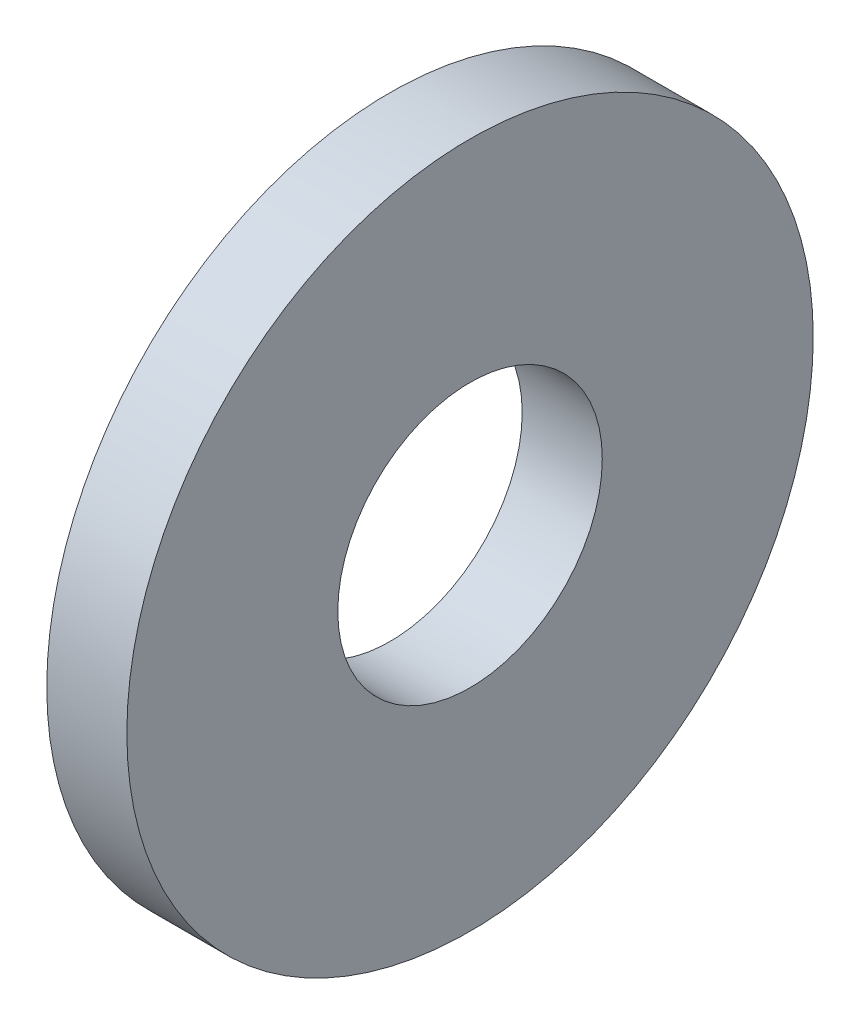
ISO-10303-21;
HEADER;
FILE_DESCRIPTION(('STEP AP214'),'2;1');
FILE_NAME('part.step','',(''),(''),'','','');
FILE_SCHEMA(('AUTOMOTIVE_DESIGN { 1 0 10303 214 1 1 1 1 }'));
ENDSEC;
DATA;
#1=APPLICATION_CONTEXT('core data for automotive mechanical design processes');
#2=APPLICATION_PROTOCOL_DEFINITION('international standard','automotive_design',2000,#1);
#3=PRODUCT_CONTEXT('',#1,'mechanical');
#4=PRODUCT('Part','Part','',(#3));
#5=PRODUCT_RELATED_PRODUCT_CATEGORY('part','',(#4));
#6=PRODUCT_DEFINITION_FORMATION('','',#4);
#7=PRODUCT_DEFINITION_CONTEXT('part definition',#1,'design');
#8=PRODUCT_DEFINITION('design','',#6,#7);
#9=PRODUCT_DEFINITION_SHAPE('','',#8);
#10=(LENGTH_UNIT() NAMED_UNIT(*) SI_UNIT(.MILLI.,.METRE.));
#11=(NAMED_UNIT(*) PLANE_ANGLE_UNIT() SI_UNIT($,.RADIAN.));
#12=(NAMED_UNIT(*) SI_UNIT($,.STERADIAN.) SOLID_ANGLE_UNIT());
#13=UNCERTAINTY_MEASURE_WITH_UNIT(LENGTH_MEASURE(1.E-05),#10,'distance_accuracy_value','');
#14=(GEOMETRIC_REPRESENTATION_CONTEXT(3) GLOBAL_UNCERTAINTY_ASSIGNED_CONTEXT((#13)) GLOBAL_UNIT_ASSIGNED_CONTEXT((#10,
#11,#12)) REPRESENTATION_CONTEXT('',''));
#15=CARTESIAN_POINT('',(0.,0.,0.));
#16=DIRECTION('',(0.,0.,1.));
#17=DIRECTION('',(1.,0.,0.));
#18=AXIS2_PLACEMENT_3D('',#15,#16,#17);
#19=CARTESIAN_POINT('',(-34.9249999999999,0.,0.));
#20=DIRECTION('',(-1.,0.,0.));
#21=DIRECTION('',(0.,0.,1.));
#22=AXIS2_PLACEMENT_3D('',#19,#20,#21);
#23=CYLINDRICAL_SURFACE('',#22,2.89);
#24=CARTESIAN_POINT('',(0.,0.,0.));
#25=DIRECTION('',(-1.,0.,0.));
#26=DIRECTION('',(0.,0.,1.));
#27=AXIS2_PLACEMENT_3D('',#24,#25,#26);
#28=CIRCLE('',#27,2.89);
#29=CARTESIAN_POINT('',(0.,0.,2.89));
#30=VERTEX_POINT('',#29);
#31=EDGE_CURVE('E10',#30,#30,#28,.T.);
#32=ORIENTED_EDGE('',*,*,#31,.F.);
#33=EDGE_LOOP('',(#32));
#34=FACE_BOUND('',#33,.T.);
#35=CARTESIAN_POINT('',(-1.75,0.,0.));
#36=DIRECTION('',(-1.,0.,0.));
#37=DIRECTION('',(0.,0.,1.));
#38=AXIS2_PLACEMENT_3D('',#35,#36,#37);
#39=CIRCLE('',#38,2.89);
#40=CARTESIAN_POINT('',(-1.75,0.,2.89));
#41=VERTEX_POINT('',#40);
#42=EDGE_CURVE('E44',#41,#41,#39,.T.);
#43=ORIENTED_EDGE('',*,*,#42,.T.);
#44=EDGE_LOOP('',(#43));
#45=FACE_BOUND('',#44,.T.);
#46=ADVANCED_FACE('F30',(#34,#45),#23,.F.);
#47=CARTESIAN_POINT('',(0.,2.89,0.));
#48=DIRECTION('',(-1.,0.,0.));
#49=DIRECTION('',(0.,0.,1.));
#50=AXIS2_PLACEMENT_3D('',#47,#48,#49);
#51=PLANE('',#50);
#52=CARTESIAN_POINT('',(0.,0.,0.));
#53=DIRECTION('',(-1.,0.,0.));
#54=DIRECTION('',(0.,0.,1.));
#55=AXIS2_PLACEMENT_3D('',#52,#53,#54);
#56=CIRCLE('',#55,7.5);
#57=CARTESIAN_POINT('',(0.,0.,7.5));
#58=VERTEX_POINT('',#57);
#59=EDGE_CURVE('E36',#58,#58,#56,.T.);
#60=ORIENTED_EDGE('',*,*,#59,.F.);
#61=EDGE_LOOP('',(#60));
#62=FACE_BOUND('',#61,.T.);
#63=ORIENTED_EDGE('',*,*,#31,.T.);
#64=EDGE_LOOP('',(#63));
#65=FACE_BOUND('',#64,.T.);
#66=ADVANCED_FACE('F59',(#62,#65),#51,.F.);
#67=CARTESIAN_POINT('',(-34.9249999999999,0.,0.));
#68=DIRECTION('',(-1.,0.,0.));
#69=DIRECTION('',(0.,0.,1.));
#70=AXIS2_PLACEMENT_3D('',#67,#68,#69);
#71=CYLINDRICAL_SURFACE('',#70,7.5);
#72=CARTESIAN_POINT('',(-1.75,0.,0.));
#73=DIRECTION('',(-1.,0.,0.));
#74=DIRECTION('',(0.,0.,1.));
#75=AXIS2_PLACEMENT_3D('',#72,#73,#74);
#76=CIRCLE('',#75,7.5);
#77=CARTESIAN_POINT('',(-1.75,0.,7.5));
#78=VERTEX_POINT('',#77);
#79=EDGE_CURVE('E40',#78,#78,#76,.T.);
#80=ORIENTED_EDGE('',*,*,#79,.F.);
#81=EDGE_LOOP('',(#80));
#82=FACE_BOUND('',#81,.T.);
#83=ORIENTED_EDGE('',*,*,#59,.T.);
#84=EDGE_LOOP('',(#83));
#85=FACE_BOUND('',#84,.T.);
#86=ADVANCED_FACE('F54',(#82,#85),#71,.T.);
#87=CARTESIAN_POINT('',(-1.75,7.5,0.));
#88=DIRECTION('',(1.,0.,0.));
#89=DIRECTION('',(0.,0.,-1.));
#90=AXIS2_PLACEMENT_3D('',#87,#88,#89);
#91=PLANE('',#90);
#92=ORIENTED_EDGE('',*,*,#42,.F.);
#93=EDGE_LOOP('',(#92));
#94=FACE_BOUND('',#93,.T.);
#95=ORIENTED_EDGE('',*,*,#79,.T.);
#96=EDGE_LOOP('',(#95));
#97=FACE_BOUND('',#96,.T.);
#98=ADVANCED_FACE('F51',(#94,#97),#91,.F.);
#99=CLOSED_SHELL('',(#46,#66,#86,#98));
#100=MANIFOLD_SOLID_BREP('B2',#99);
#101=ADVANCED_BREP_SHAPE_REPRESENTATION('',(#18,#100),#14);
#102=SHAPE_DEFINITION_REPRESENTATION(#9,#101);
ENDSEC;
END-ISO-10303-21;
